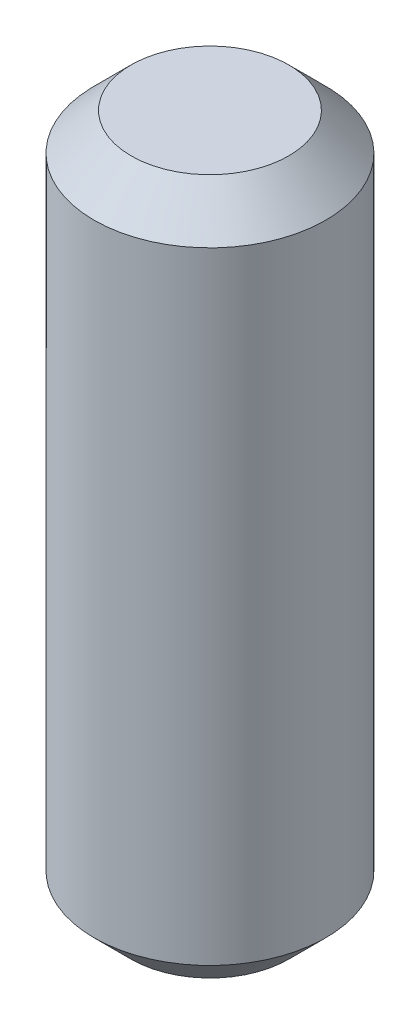
ISO-10303-21;
HEADER;
FILE_DESCRIPTION(('STEP AP214'),'2;1');
FILE_NAME('part.step','',(''),(''),'','','');
FILE_SCHEMA(('AUTOMOTIVE_DESIGN { 1 0 10303 214 1 1 1 1 }'));
ENDSEC;
DATA;
#1=APPLICATION_CONTEXT('core data for automotive mechanical design processes');
#2=APPLICATION_PROTOCOL_DEFINITION('international standard','automotive_design',2000,#1);
#3=PRODUCT_CONTEXT('',#1,'mechanical');
#4=PRODUCT('Part','Part','',(#3));
#5=PRODUCT_RELATED_PRODUCT_CATEGORY('part','',(#4));
#6=PRODUCT_DEFINITION_FORMATION('','',#4);
#7=PRODUCT_DEFINITION_CONTEXT('part definition',#1,'design');
#8=PRODUCT_DEFINITION('design','',#6,#7);
#9=PRODUCT_DEFINITION_SHAPE('','',#8);
#10=(LENGTH_UNIT() NAMED_UNIT(*) SI_UNIT(.MILLI.,.METRE.));
#11=(NAMED_UNIT(*) PLANE_ANGLE_UNIT() SI_UNIT($,.RADIAN.));
#12=(NAMED_UNIT(*) SI_UNIT($,.STERADIAN.) SOLID_ANGLE_UNIT());
#13=UNCERTAINTY_MEASURE_WITH_UNIT(LENGTH_MEASURE(1.E-05),#10,'distance_accuracy_value','');
#14=(GEOMETRIC_REPRESENTATION_CONTEXT(3) GLOBAL_UNCERTAINTY_ASSIGNED_CONTEXT((#13)) GLOBAL_UNIT_ASSIGNED_CONTEXT((#10,
#11,#12)) REPRESENTATION_CONTEXT('',''));
#15=CARTESIAN_POINT('',(0.,0.,0.));
#16=DIRECTION('',(0.,0.,1.));
#17=DIRECTION('',(1.,0.,0.));
#18=AXIS2_PLACEMENT_3D('',#15,#16,#17);
#19=CARTESIAN_POINT('',(0.,15.,0.));
#20=DIRECTION('',(0.,-1.,0.));
#21=DIRECTION('',(0.,0.,-1.));
#22=AXIS2_PLACEMENT_3D('',#19,#20,#21);
#23=CYLINDRICAL_SURFACE('',#22,2.5);
#24=CARTESIAN_POINT('',(0.,0.800000000000006,0.));
#25=DIRECTION('',(0.,1.,0.));
#26=DIRECTION('',(0.,0.,1.));
#27=AXIS2_PLACEMENT_3D('',#24,#25,#26);
#28=CIRCLE('',#27,2.5);
#29=CARTESIAN_POINT('',(0.,0.800000000000006,2.5));
#30=VERTEX_POINT('',#29);
#31=EDGE_CURVE('E53',#30,#30,#28,.T.);
#32=ORIENTED_EDGE('',*,*,#31,.T.);
#33=EDGE_LOOP('',(#32));
#34=FACE_BOUND('',#33,.T.);
#35=CARTESIAN_POINT('',(0.,14.2,0.));
#36=DIRECTION('',(0.,1.,0.));
#37=DIRECTION('',(0.,0.,1.));
#38=AXIS2_PLACEMENT_3D('',#35,#36,#37);
#39=CIRCLE('',#38,2.5);
#40=CARTESIAN_POINT('',(0.,14.2,2.5));
#41=VERTEX_POINT('',#40);
#42=EDGE_CURVE('E57',#41,#41,#39,.F.);
#43=ORIENTED_EDGE('',*,*,#42,.T.);
#44=EDGE_LOOP('',(#43));
#45=FACE_BOUND('',#44,.T.);
#46=ADVANCED_FACE('F41',(#34,#45),#23,.T.);
#47=CARTESIAN_POINT('',(0.,15.,0.));
#48=DIRECTION('',(0.,1.,0.));
#49=DIRECTION('',(0.,0.,1.));
#50=AXIS2_PLACEMENT_3D('',#47,#48,#49);
#51=PLANE('',#50);
#52=CARTESIAN_POINT('',(0.,15.,0.));
#53=DIRECTION('',(0.,1.,0.));
#54=DIRECTION('',(0.,0.,1.));
#55=AXIS2_PLACEMENT_3D('',#52,#53,#54);
#56=CIRCLE('',#55,1.69999999999999);
#57=CARTESIAN_POINT('',(0.,15.,1.69999999999999));
#58=VERTEX_POINT('',#57);
#59=EDGE_CURVE('E10',#58,#58,#56,.T.);
#60=ORIENTED_EDGE('',*,*,#59,.T.);
#61=EDGE_LOOP('',(#60));
#62=FACE_BOUND('',#61,.T.);
#63=ADVANCED_FACE('F73',(#62),#51,.T.);
#64=CARTESIAN_POINT('',(0.,0.,0.));
#65=DIRECTION('',(0.,1.,0.));
#66=DIRECTION('',(0.,0.,1.));
#67=AXIS2_PLACEMENT_3D('',#64,#65,#66);
#68=PLANE('',#67);
#69=CARTESIAN_POINT('',(0.,0.,0.));
#70=DIRECTION('',(0.,1.,0.));
#71=DIRECTION('',(0.,0.,1.));
#72=AXIS2_PLACEMENT_3D('',#69,#70,#71);
#73=CIRCLE('',#72,1.69999999999999);
#74=CARTESIAN_POINT('',(0.,0.,1.69999999999999));
#75=VERTEX_POINT('',#74);
#76=EDGE_CURVE('E49',#75,#75,#73,.F.);
#77=ORIENTED_EDGE('',*,*,#76,.T.);
#78=EDGE_LOOP('',(#77));
#79=FACE_BOUND('',#78,.T.);
#80=ADVANCED_FACE('F70',(#79),#68,.F.);
#81=CARTESIAN_POINT('',(0.,0.800000000000006,0.));
#82=DIRECTION('',(0.,1.,0.));
#83=DIRECTION('',(0.,0.,1.));
#84=AXIS2_PLACEMENT_3D('',#81,#82,#83);
#85=CONICAL_SURFACE('',#84,2.5,0.785398163397448);
#86=ORIENTED_EDGE('',*,*,#76,.F.);
#87=EDGE_LOOP('',(#86));
#88=FACE_BOUND('',#87,.T.);
#89=ORIENTED_EDGE('',*,*,#31,.F.);
#90=EDGE_LOOP('',(#89));
#91=FACE_BOUND('',#90,.T.);
#92=ADVANCED_FACE('F66',(#88,#91),#85,.T.);
#93=CARTESIAN_POINT('',(0.,15.,0.));
#94=DIRECTION('',(0.,-1.,0.));
#95=DIRECTION('',(0.,0.,-1.));
#96=AXIS2_PLACEMENT_3D('',#93,#94,#95);
#97=CONICAL_SURFACE('',#96,1.69999999999999,0.785398163397448);
#98=ORIENTED_EDGE('',*,*,#42,.F.);
#99=EDGE_LOOP('',(#98));
#100=FACE_BOUND('',#99,.T.);
#101=ORIENTED_EDGE('',*,*,#59,.F.);
#102=EDGE_LOOP('',(#101));
#103=FACE_BOUND('',#102,.T.);
#104=ADVANCED_FACE('F44',(#100,#103),#97,.T.);
#105=CLOSED_SHELL('',(#46,#63,#80,#92,#104));
#106=MANIFOLD_SOLID_BREP('B2',#105);
#107=ADVANCED_BREP_SHAPE_REPRESENTATION('',(#18,#106),#14);
#108=SHAPE_DEFINITION_REPRESENTATION(#9,#107);
ENDSEC;
END-ISO-10303-21;
